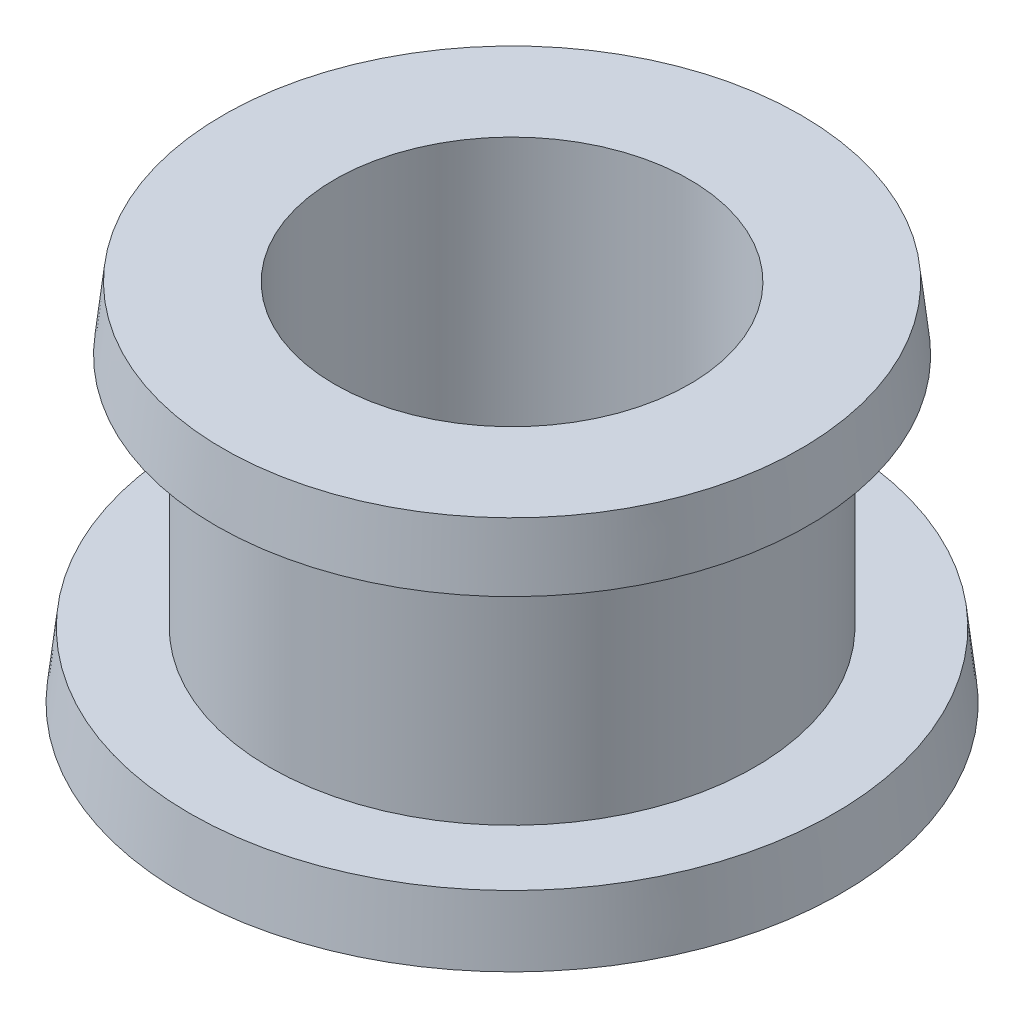
ISO-10303-21;
HEADER;
FILE_DESCRIPTION(('STEP AP214'),'2;1');
FILE_NAME('part.step','',(''),(''),'','','');
FILE_SCHEMA(('AUTOMOTIVE_DESIGN { 1 0 10303 214 1 1 1 1 }'));
ENDSEC;
DATA;
#1=APPLICATION_CONTEXT('core data for automotive mechanical design processes');
#2=APPLICATION_PROTOCOL_DEFINITION('international standard','automotive_design',2000,#1);
#3=PRODUCT_CONTEXT('',#1,'mechanical');
#4=PRODUCT('Part','Part','',(#3));
#5=PRODUCT_RELATED_PRODUCT_CATEGORY('part','',(#4));
#6=PRODUCT_DEFINITION_FORMATION('','',#4);
#7=PRODUCT_DEFINITION_CONTEXT('part definition',#1,'design');
#8=PRODUCT_DEFINITION('design','',#6,#7);
#9=PRODUCT_DEFINITION_SHAPE('','',#8);
#10=(LENGTH_UNIT() NAMED_UNIT(*) SI_UNIT(.MILLI.,.METRE.));
#11=(NAMED_UNIT(*) PLANE_ANGLE_UNIT() SI_UNIT($,.RADIAN.));
#12=(NAMED_UNIT(*) SI_UNIT($,.STERADIAN.) SOLID_ANGLE_UNIT());
#13=UNCERTAINTY_MEASURE_WITH_UNIT(LENGTH_MEASURE(1.E-05),#10,'distance_accuracy_value','');
#14=(GEOMETRIC_REPRESENTATION_CONTEXT(3) GLOBAL_UNCERTAINTY_ASSIGNED_CONTEXT((#13)) GLOBAL_UNIT_ASSIGNED_CONTEXT((#10,
#11,#12)) REPRESENTATION_CONTEXT('',''));
#15=CARTESIAN_POINT('',(0.,0.,0.));
#16=DIRECTION('',(0.,0.,1.));
#17=DIRECTION('',(1.,0.,0.));
#18=AXIS2_PLACEMENT_3D('',#15,#16,#17);
#19=CARTESIAN_POINT('',(0.,2.85676933888275,0.));
#20=DIRECTION('',(0.,1.,0.));
#21=DIRECTION('',(0.,0.,1.));
#22=AXIS2_PLACEMENT_3D('',#19,#20,#21);
#23=PLANE('',#22);
#24=CARTESIAN_POINT('',(0.,2.85676933888275,0.));
#25=DIRECTION('',(0.,1.,0.));
#26=DIRECTION('',(0.,0.,1.));
#27=AXIS2_PLACEMENT_3D('',#24,#25,#26);
#28=CIRCLE('',#27,1.5);
#29=CARTESIAN_POINT('',(0.,2.85676933888275,1.5));
#30=VERTEX_POINT('',#29);
#31=EDGE_CURVE('E60',#30,#30,#28,.T.);
#32=ORIENTED_EDGE('',*,*,#31,.F.);
#33=EDGE_LOOP('',(#32));
#34=FACE_BOUND('',#33,.T.);
#35=CARTESIAN_POINT('',(0.,2.85676933888275,0.));
#36=DIRECTION('',(0.,-1.,0.));
#37=DIRECTION('',(0.,0.,-1.));
#38=AXIS2_PLACEMENT_3D('',#35,#36,#37);
#39=CIRCLE('',#38,2.44299179455576);
#40=CARTESIAN_POINT('',(0.,2.85676933888275,-2.44299179455576));
#41=VERTEX_POINT('',#40);
#42=EDGE_CURVE('E10',#41,#41,#39,.T.);
#43=ORIENTED_EDGE('',*,*,#42,.F.);
#44=EDGE_LOOP('',(#43));
#45=FACE_BOUND('',#44,.T.);
#46=ADVANCED_FACE('F34',(#34,#45),#23,.T.);
#47=CARTESIAN_POINT('',(0.,2.32168249219886,0.));
#48=DIRECTION('',(0.,-1.,0.));
#49=DIRECTION('',(0.,0.,-1.));
#50=AXIS2_PLACEMENT_3D('',#47,#48,#49);
#51=CONICAL_SURFACE('',#50,2.50262995702539,0.110997010474696);
#52=ORIENTED_EDGE('',*,*,#42,.T.);
#53=EDGE_LOOP('',(#52));
#54=FACE_BOUND('',#53,.T.);
#55=CARTESIAN_POINT('',(0.,2.32168249219886,0.));
#56=DIRECTION('',(0.,-1.,0.));
#57=DIRECTION('',(0.,0.,-1.));
#58=AXIS2_PLACEMENT_3D('',#55,#56,#57);
#59=CIRCLE('',#58,2.50262995702539);
#60=CARTESIAN_POINT('',(0.,2.32168249219886,-2.50262995702539));
#61=VERTEX_POINT('',#60);
#62=EDGE_CURVE('E40',#61,#61,#59,.T.);
#63=ORIENTED_EDGE('',*,*,#62,.F.);
#64=EDGE_LOOP('',(#63));
#65=FACE_BOUND('',#64,.T.);
#66=ADVANCED_FACE('F77',(#54,#65),#51,.T.);
#67=CARTESIAN_POINT('',(2.50262995702539,2.32168249219886,0.));
#68=DIRECTION('',(0.,-1.,0.));
#69=DIRECTION('',(0.,0.,-1.));
#70=AXIS2_PLACEMENT_3D('',#67,#68,#69);
#71=PLANE('',#70);
#72=ORIENTED_EDGE('',*,*,#62,.T.);
#73=EDGE_LOOP('',(#72));
#74=FACE_BOUND('',#73,.T.);
#75=CARTESIAN_POINT('',(0.,2.32168249219886,0.));
#76=DIRECTION('',(0.,-1.,0.));
#77=DIRECTION('',(0.,0.,-1.));
#78=AXIS2_PLACEMENT_3D('',#75,#76,#77);
#79=CIRCLE('',#78,2.04973913483535);
#80=CARTESIAN_POINT('',(0.,2.32168249219886,-2.04973913483535));
#81=VERTEX_POINT('',#80);
#82=EDGE_CURVE('E44',#81,#81,#79,.T.);
#83=ORIENTED_EDGE('',*,*,#82,.F.);
#84=EDGE_LOOP('',(#83));
#85=FACE_BOUND('',#84,.T.);
#86=ADVANCED_FACE('F81',(#74,#85),#71,.T.);
#87=CARTESIAN_POINT('',(0.,0.,0.));
#88=DIRECTION('',(0.,-1.,0.));
#89=DIRECTION('',(0.,0.,-1.));
#90=AXIS2_PLACEMENT_3D('',#87,#88,#89);
#91=CYLINDRICAL_SURFACE('',#90,2.04973913483535);
#92=ORIENTED_EDGE('',*,*,#82,.T.);
#93=EDGE_LOOP('',(#92));
#94=FACE_BOUND('',#93,.T.);
#95=CARTESIAN_POINT('',(0.,0.327040741923787,0.));
#96=DIRECTION('',(0.,-1.,0.));
#97=DIRECTION('',(0.,0.,-1.));
#98=AXIS2_PLACEMENT_3D('',#95,#96,#97);
#99=CIRCLE('',#98,2.04973913483535);
#100=CARTESIAN_POINT('',(0.,0.327040741923787,-2.04973913483535));
#101=VERTEX_POINT('',#100);
#102=EDGE_CURVE('E48',#101,#101,#99,.T.);
#103=ORIENTED_EDGE('',*,*,#102,.F.);
#104=EDGE_LOOP('',(#103));
#105=FACE_BOUND('',#104,.T.);
#106=ADVANCED_FACE('F85',(#94,#105),#91,.T.);
#107=CARTESIAN_POINT('',(2.04973913483535,0.327040741923787,0.));
#108=DIRECTION('',(0.,1.,0.));
#109=DIRECTION('',(0.,0.,1.));
#110=AXIS2_PLACEMENT_3D('',#107,#108,#109);
#111=PLANE('',#110);
#112=ORIENTED_EDGE('',*,*,#102,.T.);
#113=EDGE_LOOP('',(#112));
#114=FACE_BOUND('',#113,.T.);
#115=CARTESIAN_POINT('',(0.,0.327040741923787,0.));
#116=DIRECTION('',(0.,-1.,0.));
#117=DIRECTION('',(0.,0.,-1.));
#118=AXIS2_PLACEMENT_3D('',#115,#116,#117);
#119=CIRCLE('',#118,2.72494296940616);
#120=CARTESIAN_POINT('',(0.,0.327040741923787,-2.72494296940616));
#121=VERTEX_POINT('',#120);
#122=EDGE_CURVE('E53',#121,#121,#119,.T.);
#123=ORIENTED_EDGE('',*,*,#122,.F.);
#124=EDGE_LOOP('',(#123));
#125=FACE_BOUND('',#124,.T.);
#126=ADVANCED_FACE('F91',(#114,#125),#111,.T.);
#127=CARTESIAN_POINT('',(0.,-0.225599214352936,0.));
#128=DIRECTION('',(0.,-1.,0.));
#129=DIRECTION('',(0.,0.,-1.));
#130=AXIS2_PLACEMENT_3D('',#127,#128,#129);
#131=CONICAL_SURFACE('',#130,2.7865375156072,0.110997010474697);
#132=ORIENTED_EDGE('',*,*,#122,.T.);
#133=EDGE_LOOP('',(#132));
#134=FACE_BOUND('',#133,.T.);
#135=CARTESIAN_POINT('',(0.,-0.225599214352936,0.));
#136=DIRECTION('',(0.,-1.,0.));
#137=DIRECTION('',(0.,0.,-1.));
#138=AXIS2_PLACEMENT_3D('',#135,#136,#137);
#139=CIRCLE('',#138,2.7865375156072);
#140=CARTESIAN_POINT('',(0.,-0.225599214352936,-2.7865375156072));
#141=VERTEX_POINT('',#140);
#142=EDGE_CURVE('E56',#141,#141,#139,.T.);
#143=ORIENTED_EDGE('',*,*,#142,.F.);
#144=EDGE_LOOP('',(#143));
#145=FACE_BOUND('',#144,.T.);
#146=ADVANCED_FACE('F95',(#134,#145),#131,.T.);
#147=CARTESIAN_POINT('',(2.7865375156072,-0.225599214352936,0.));
#148=DIRECTION('',(0.,-1.,0.));
#149=DIRECTION('',(0.,0.,-1.));
#150=AXIS2_PLACEMENT_3D('',#147,#148,#149);
#151=PLANE('',#150);
#152=CARTESIAN_POINT('',(0.,-0.225599214352936,0.));
#153=DIRECTION('',(0.,1.,0.));
#154=DIRECTION('',(0.,0.,1.));
#155=AXIS2_PLACEMENT_3D('',#152,#153,#154);
#156=CIRCLE('',#155,1.5);
#157=CARTESIAN_POINT('',(0.,-0.225599214352936,1.5));
#158=VERTEX_POINT('',#157);
#159=EDGE_CURVE('E59',#158,#158,#156,.T.);
#160=ORIENTED_EDGE('',*,*,#159,.T.);
#161=EDGE_LOOP('',(#160));
#162=FACE_BOUND('',#161,.T.);
#163=ORIENTED_EDGE('',*,*,#142,.T.);
#164=EDGE_LOOP('',(#163));
#165=FACE_BOUND('',#164,.T.);
#166=ADVANCED_FACE('F66',(#162,#165),#151,.T.);
#167=CARTESIAN_POINT('',(0.,-0.225599214352936,0.));
#168=DIRECTION('',(0.,1.,0.));
#169=DIRECTION('',(0.,0.,1.));
#170=AXIS2_PLACEMENT_3D('',#167,#168,#169);
#171=CYLINDRICAL_SURFACE('',#170,1.5);
#172=ORIENTED_EDGE('',*,*,#159,.F.);
#173=EDGE_LOOP('',(#172));
#174=FACE_BOUND('',#173,.T.);
#175=ORIENTED_EDGE('',*,*,#31,.T.);
#176=EDGE_LOOP('',(#175));
#177=FACE_BOUND('',#176,.T.);
#178=ADVANCED_FACE('F69',(#174,#177),#171,.F.);
#179=CLOSED_SHELL('',(#46,#66,#86,#106,#126,#146,#166,#178));
#180=MANIFOLD_SOLID_BREP('B2',#179);
#181=ADVANCED_BREP_SHAPE_REPRESENTATION('',(#18,#180),#14);
#182=SHAPE_DEFINITION_REPRESENTATION(#9,#181);
ENDSEC;
END-ISO-10303-21;
